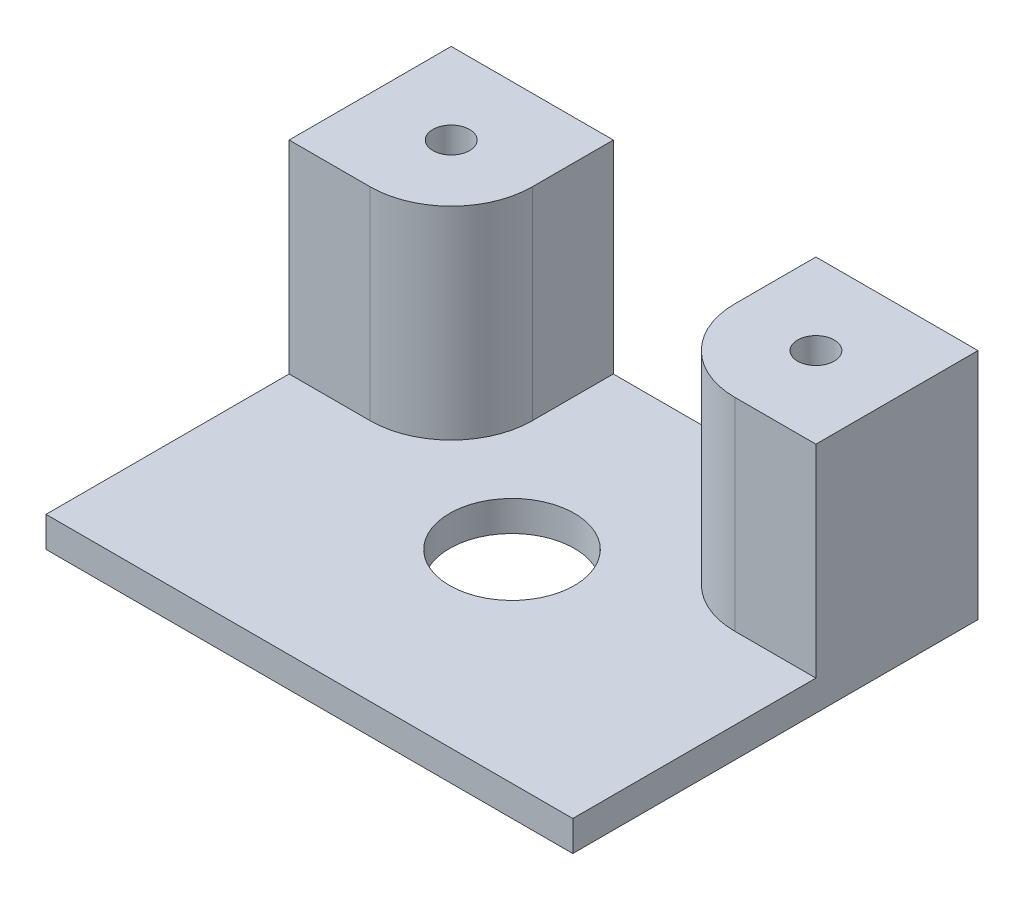
ISO-10303-21;
HEADER;
FILE_DESCRIPTION(('STEP AP214'),'2;1');
FILE_NAME('part.step','',(''),(''),'','','');
FILE_SCHEMA(('AUTOMOTIVE_DESIGN { 1 0 10303 214 1 1 1 1 }'));
ENDSEC;
DATA;
#1=APPLICATION_CONTEXT('core data for automotive mechanical design processes');
#2=APPLICATION_PROTOCOL_DEFINITION('international standard','automotive_design',2000,#1);
#3=PRODUCT_CONTEXT('',#1,'mechanical');
#4=PRODUCT('Part','Part','',(#3));
#5=PRODUCT_RELATED_PRODUCT_CATEGORY('part','',(#4));
#6=PRODUCT_DEFINITION_FORMATION('','',#4);
#7=PRODUCT_DEFINITION_CONTEXT('part definition',#1,'design');
#8=PRODUCT_DEFINITION('design','',#6,#7);
#9=PRODUCT_DEFINITION_SHAPE('','',#8);
#10=(LENGTH_UNIT() NAMED_UNIT(*) SI_UNIT(.MILLI.,.METRE.));
#11=(NAMED_UNIT(*) PLANE_ANGLE_UNIT() SI_UNIT($,.RADIAN.));
#12=(NAMED_UNIT(*) SI_UNIT($,.STERADIAN.) SOLID_ANGLE_UNIT());
#13=UNCERTAINTY_MEASURE_WITH_UNIT(LENGTH_MEASURE(1.E-05),#10,'distance_accuracy_value','');
#14=(GEOMETRIC_REPRESENTATION_CONTEXT(3) GLOBAL_UNCERTAINTY_ASSIGNED_CONTEXT((#13)) GLOBAL_UNIT_ASSIGNED_CONTEXT((#10,
#11,#12)) REPRESENTATION_CONTEXT('',''));
#15=CARTESIAN_POINT('',(0.,0.,0.));
#16=DIRECTION('',(0.,0.,1.));
#17=DIRECTION('',(1.,0.,0.));
#18=AXIS2_PLACEMENT_3D('',#15,#16,#17);
#19=CARTESIAN_POINT('',(0.,9.525,0.));
#20=DIRECTION('',(0.,-1.,0.));
#21=DIRECTION('',(0.,0.,-1.));
#22=AXIS2_PLACEMENT_3D('',#19,#20,#21);
#23=PLANE('',#22);
#24=CARTESIAN_POINT('',(82.55,9.525,-63.5));
#25=DIRECTION('',(0.,1.,0.));
#26=DIRECTION('',(0.,0.,1.));
#27=AXIS2_PLACEMENT_3D('',#24,#25,#26);
#28=CIRCLE('',#27,19.5794449035741);
#29=CARTESIAN_POINT('',(82.55,9.525,-43.9205550964259));
#30=VERTEX_POINT('',#29);
#31=EDGE_CURVE('E214',#30,#30,#28,.T.);
#32=ORIENTED_EDGE('',*,*,#31,.F.);
#33=EDGE_LOOP('',(#32));
#34=FACE_BOUND('',#33,.T.);
#35=DIRECTION('',(0.,0.,1.));
#36=VECTOR('',#35,1.);
#37=CARTESIAN_POINT('',(114.3,9.525,-127.));
#38=LINE('',#37,#36);
#39=CARTESIAN_POINT('',(114.3,9.525,-127.));
#40=VERTEX_POINT('',#39);
#41=CARTESIAN_POINT('',(114.3,9.52500000000001,-101.6));
#42=VERTEX_POINT('',#41);
#43=EDGE_CURVE('E154',#40,#42,#38,.T.);
#44=ORIENTED_EDGE('',*,*,#43,.F.);
#45=DIRECTION('',(-1.,0.,0.));
#46=VECTOR('',#45,1.);
#47=CARTESIAN_POINT('',(0.,9.525,-127.));
#48=LINE('',#47,#46);
#49=CARTESIAN_POINT('',(50.8,9.525,-127.));
#50=VERTEX_POINT('',#49);
#51=EDGE_CURVE('E228',#40,#50,#48,.T.);
#52=ORIENTED_EDGE('',*,*,#51,.T.);
#53=DIRECTION('',(0.,0.,-1.));
#54=VECTOR('',#53,1.);
#55=CARTESIAN_POINT('',(50.8,9.525,-127.));
#56=LINE('',#55,#54);
#57=CARTESIAN_POINT('',(50.8,9.525,-101.6));
#58=VERTEX_POINT('',#57);
#59=EDGE_CURVE('E186',#58,#50,#56,.T.);
#60=ORIENTED_EDGE('',*,*,#59,.F.);
#61=CARTESIAN_POINT('',(25.4,9.525,-101.6));
#62=DIRECTION('',(0.,1.,0.));
#63=DIRECTION('',(0.,0.,-1.));
#64=AXIS2_PLACEMENT_3D('',#61,#62,#63);
#65=CIRCLE('',#64,25.4);
#66=CARTESIAN_POINT('',(25.4,9.525,-76.2));
#67=VERTEX_POINT('',#66);
#68=EDGE_CURVE('E198',#67,#58,#65,.T.);
#69=ORIENTED_EDGE('',*,*,#68,.F.);
#70=DIRECTION('',(1.,0.,0.));
#71=VECTOR('',#70,1.);
#72=CARTESIAN_POINT('',(0.,9.525,-76.2));
#73=LINE('',#72,#71);
#74=CARTESIAN_POINT('',(0.,9.525,-76.2));
#75=VERTEX_POINT('',#74);
#76=EDGE_CURVE('E181',#75,#67,#73,.T.);
#77=ORIENTED_EDGE('',*,*,#76,.F.);
#78=DIRECTION('',(0.,0.,1.));
#79=VECTOR('',#78,1.);
#80=CARTESIAN_POINT('',(0.,9.525,0.));
#81=LINE('',#80,#79);
#82=CARTESIAN_POINT('',(0.,9.525,0.));
#83=VERTEX_POINT('',#82);
#84=EDGE_CURVE('E221',#75,#83,#81,.T.);
#85=ORIENTED_EDGE('',*,*,#84,.T.);
#86=DIRECTION('',(1.,0.,0.));
#87=VECTOR('',#86,1.);
#88=CARTESIAN_POINT('',(0.,9.525,0.));
#89=LINE('',#88,#87);
#90=CARTESIAN_POINT('',(165.1,9.525,0.));
#91=VERTEX_POINT('',#90);
#92=EDGE_CURVE('E223',#83,#91,#89,.T.);
#93=ORIENTED_EDGE('',*,*,#92,.T.);
#94=DIRECTION('',(0.,0.,-1.));
#95=VECTOR('',#94,1.);
#96=CARTESIAN_POINT('',(165.1,9.525,0.));
#97=LINE('',#96,#95);
#98=CARTESIAN_POINT('',(165.1,9.525,-76.2));
#99=VERTEX_POINT('',#98);
#100=EDGE_CURVE('E226',#91,#99,#97,.T.);
#101=ORIENTED_EDGE('',*,*,#100,.T.);
#102=DIRECTION('',(1.,0.,0.));
#103=VECTOR('',#102,1.);
#104=CARTESIAN_POINT('',(165.1,9.525,-76.2));
#105=LINE('',#104,#103);
#106=CARTESIAN_POINT('',(139.7,9.525,-76.2));
#107=VERTEX_POINT('',#106);
#108=EDGE_CURVE('E61',#107,#99,#105,.T.);
#109=ORIENTED_EDGE('',*,*,#108,.F.);
#110=CARTESIAN_POINT('',(139.7,9.525,-101.6));
#111=DIRECTION('',(0.,1.,0.));
#112=DIRECTION('',(0.,0.,1.));
#113=AXIS2_PLACEMENT_3D('',#110,#111,#112);
#114=CIRCLE('',#113,25.4);
#115=EDGE_CURVE('E56',#42,#107,#114,.T.);
#116=ORIENTED_EDGE('',*,*,#115,.F.);
#117=EDGE_LOOP('',(#44,#52,#60,#69,#77,#85,#93,#101,#109,#116));
#118=FACE_BOUND('',#117,.T.);
#119=ADVANCED_FACE('F41',(#34,#118),#23,.F.);
#120=CARTESIAN_POINT('',(0.,9.525,0.));
#121=DIRECTION('',(1.,0.,0.));
#122=DIRECTION('',(0.,0.,-1.));
#123=AXIS2_PLACEMENT_3D('',#120,#121,#122);
#124=PLANE('',#123);
#125=DIRECTION('',(0.,0.,1.));
#126=VECTOR('',#125,1.);
#127=CARTESIAN_POINT('',(0.,0.,0.));
#128=LINE('',#127,#126);
#129=CARTESIAN_POINT('',(0.,0.,-127.));
#130=VERTEX_POINT('',#129);
#131=CARTESIAN_POINT('',(0.,0.,0.));
#132=VERTEX_POINT('',#131);
#133=EDGE_CURVE('E218',#130,#132,#128,.T.);
#134=ORIENTED_EDGE('',*,*,#133,.T.);
#135=DIRECTION('',(0.,-1.,0.));
#136=VECTOR('',#135,1.);
#137=CARTESIAN_POINT('',(0.,9.525,0.));
#138=LINE('',#137,#136);
#139=EDGE_CURVE('E11',#83,#132,#138,.T.);
#140=ORIENTED_EDGE('',*,*,#139,.F.);
#141=ORIENTED_EDGE('',*,*,#84,.F.);
#142=DIRECTION('',(0.,-1.,0.));
#143=VECTOR('',#142,1.);
#144=CARTESIAN_POINT('',(0.,73.025,-76.2));
#145=LINE('',#144,#143);
#146=CARTESIAN_POINT('',(0.,73.025,-76.2));
#147=VERTEX_POINT('',#146);
#148=EDGE_CURVE('E211',#147,#75,#145,.T.);
#149=ORIENTED_EDGE('',*,*,#148,.F.);
#150=DIRECTION('',(0.,0.,1.));
#151=VECTOR('',#150,1.);
#152=CARTESIAN_POINT('',(0.,73.025,-127.));
#153=LINE('',#152,#151);
#154=CARTESIAN_POINT('',(0.,73.025,-127.));
#155=VERTEX_POINT('',#154);
#156=EDGE_CURVE('E182',#155,#147,#153,.T.);
#157=ORIENTED_EDGE('',*,*,#156,.F.);
#158=DIRECTION('',(0.,-1.,0.));
#159=VECTOR('',#158,1.);
#160=CARTESIAN_POINT('',(0.,9.525,-127.));
#161=LINE('',#160,#159);
#162=EDGE_CURVE('E230',#155,#130,#161,.T.);
#163=ORIENTED_EDGE('',*,*,#162,.T.);
#164=EDGE_LOOP('',(#134,#140,#141,#149,#157,#163));
#165=FACE_BOUND('',#164,.T.);
#166=ADVANCED_FACE('F43',(#165),#124,.F.);
#167=CARTESIAN_POINT('',(0.,9.525,0.));
#168=DIRECTION('',(0.,0.,-1.));
#169=DIRECTION('',(-1.,0.,0.));
#170=AXIS2_PLACEMENT_3D('',#167,#168,#169);
#171=PLANE('',#170);
#172=DIRECTION('',(1.,0.,0.));
#173=VECTOR('',#172,1.);
#174=CARTESIAN_POINT('',(0.,0.,0.));
#175=LINE('',#174,#173);
#176=CARTESIAN_POINT('',(165.1,0.,0.));
#177=VERTEX_POINT('',#176);
#178=EDGE_CURVE('E233',#132,#177,#175,.T.);
#179=ORIENTED_EDGE('',*,*,#178,.T.);
#180=DIRECTION('',(0.,-1.,0.));
#181=VECTOR('',#180,1.);
#182=CARTESIAN_POINT('',(165.1,9.525,0.));
#183=LINE('',#182,#181);
#184=EDGE_CURVE('E49',#91,#177,#183,.T.);
#185=ORIENTED_EDGE('',*,*,#184,.F.);
#186=ORIENTED_EDGE('',*,*,#92,.F.);
#187=ORIENTED_EDGE('',*,*,#139,.T.);
#188=EDGE_LOOP('',(#179,#185,#186,#187));
#189=FACE_BOUND('',#188,.T.);
#190=ADVANCED_FACE('F277',(#189),#171,.F.);
#191=CARTESIAN_POINT('',(165.1,9.525,0.));
#192=DIRECTION('',(-1.,0.,0.));
#193=DIRECTION('',(0.,0.,1.));
#194=AXIS2_PLACEMENT_3D('',#191,#192,#193);
#195=PLANE('',#194);
#196=DIRECTION('',(0.,0.,-1.));
#197=VECTOR('',#196,1.);
#198=CARTESIAN_POINT('',(165.1,0.,0.));
#199=LINE('',#198,#197);
#200=CARTESIAN_POINT('',(165.1,0.,-127.));
#201=VERTEX_POINT('',#200);
#202=EDGE_CURVE('E235',#177,#201,#199,.T.);
#203=ORIENTED_EDGE('',*,*,#202,.T.);
#204=DIRECTION('',(0.,-1.,0.));
#205=VECTOR('',#204,1.);
#206=CARTESIAN_POINT('',(165.1,9.525,-127.));
#207=LINE('',#206,#205);
#208=CARTESIAN_POINT('',(165.1,73.025,-127.));
#209=VERTEX_POINT('',#208);
#210=EDGE_CURVE('E240',#209,#201,#207,.T.);
#211=ORIENTED_EDGE('',*,*,#210,.F.);
#212=DIRECTION('',(0.,0.,-1.));
#213=VECTOR('',#212,1.);
#214=CARTESIAN_POINT('',(165.1,73.025,-127.));
#215=LINE('',#214,#213);
#216=CARTESIAN_POINT('',(165.1,73.025,-76.2));
#217=VERTEX_POINT('',#216);
#218=EDGE_CURVE('E155',#217,#209,#215,.T.);
#219=ORIENTED_EDGE('',*,*,#218,.F.);
#220=DIRECTION('',(0.,-1.,0.));
#221=VECTOR('',#220,1.);
#222=CARTESIAN_POINT('',(165.1,73.025,-76.2));
#223=LINE('',#222,#221);
#224=EDGE_CURVE('E166',#217,#99,#223,.T.);
#225=ORIENTED_EDGE('',*,*,#224,.T.);
#226=ORIENTED_EDGE('',*,*,#100,.F.);
#227=ORIENTED_EDGE('',*,*,#184,.T.);
#228=EDGE_LOOP('',(#203,#211,#219,#225,#226,#227));
#229=FACE_BOUND('',#228,.T.);
#230=ADVANCED_FACE('F247',(#229),#195,.F.);
#231=CARTESIAN_POINT('',(0.,9.525,-127.));
#232=DIRECTION('',(0.,0.,1.));
#233=DIRECTION('',(1.,0.,0.));
#234=AXIS2_PLACEMENT_3D('',#231,#232,#233);
#235=PLANE('',#234);
#236=DIRECTION('',(-1.,0.,0.));
#237=VECTOR('',#236,1.);
#238=CARTESIAN_POINT('',(0.,0.,-127.));
#239=LINE('',#238,#237);
#240=EDGE_CURVE('E224',#201,#130,#239,.T.);
#241=ORIENTED_EDGE('',*,*,#240,.T.);
#242=ORIENTED_EDGE('',*,*,#162,.F.);
#243=DIRECTION('',(-1.,0.,0.));
#244=VECTOR('',#243,1.);
#245=CARTESIAN_POINT('',(0.,73.025,-127.));
#246=LINE('',#245,#244);
#247=CARTESIAN_POINT('',(50.8,73.025,-127.));
#248=VERTEX_POINT('',#247);
#249=EDGE_CURVE('E192',#248,#155,#246,.T.);
#250=ORIENTED_EDGE('',*,*,#249,.F.);
#251=DIRECTION('',(0.,-1.,0.));
#252=VECTOR('',#251,1.);
#253=CARTESIAN_POINT('',(50.8,73.025,-127.));
#254=LINE('',#253,#252);
#255=EDGE_CURVE('E195',#248,#50,#254,.T.);
#256=ORIENTED_EDGE('',*,*,#255,.T.);
#257=ORIENTED_EDGE('',*,*,#51,.F.);
#258=DIRECTION('',(0.,-1.,0.));
#259=VECTOR('',#258,1.);
#260=CARTESIAN_POINT('',(114.3,73.025,-127.));
#261=LINE('',#260,#259);
#262=CARTESIAN_POINT('',(114.3,73.025,-127.));
#263=VERTEX_POINT('',#262);
#264=EDGE_CURVE('E178',#263,#40,#261,.T.);
#265=ORIENTED_EDGE('',*,*,#264,.F.);
#266=DIRECTION('',(-1.,0.,0.));
#267=VECTOR('',#266,1.);
#268=CARTESIAN_POINT('',(165.1,73.025,-127.));
#269=LINE('',#268,#267);
#270=EDGE_CURVE('E158',#209,#263,#269,.T.);
#271=ORIENTED_EDGE('',*,*,#270,.F.);
#272=ORIENTED_EDGE('',*,*,#210,.T.);
#273=EDGE_LOOP('',(#241,#242,#250,#256,#257,#265,#271,#272));
#274=FACE_BOUND('',#273,.T.);
#275=ADVANCED_FACE('F255',(#274),#235,.F.);
#276=CARTESIAN_POINT('',(0.,0.,0.));
#277=DIRECTION('',(0.,-1.,0.));
#278=DIRECTION('',(0.,0.,-1.));
#279=AXIS2_PLACEMENT_3D('',#276,#277,#278);
#280=PLANE('',#279);
#281=CARTESIAN_POINT('',(82.55,0.,-63.5));
#282=DIRECTION('',(0.,1.,0.));
#283=DIRECTION('',(0.,0.,1.));
#284=AXIS2_PLACEMENT_3D('',#281,#282,#283);
#285=CIRCLE('',#284,19.5794449035741);
#286=CARTESIAN_POINT('',(82.55,0.,-43.9205550964259));
#287=VERTEX_POINT('',#286);
#288=EDGE_CURVE('E215',#287,#287,#285,.T.);
#289=ORIENTED_EDGE('',*,*,#288,.T.);
#290=EDGE_LOOP('',(#289));
#291=FACE_BOUND('',#290,.T.);
#292=ORIENTED_EDGE('',*,*,#133,.F.);
#293=ORIENTED_EDGE('',*,*,#240,.F.);
#294=ORIENTED_EDGE('',*,*,#202,.F.);
#295=ORIENTED_EDGE('',*,*,#178,.F.);
#296=EDGE_LOOP('',(#292,#293,#294,#295));
#297=FACE_BOUND('',#296,.T.);
#298=ADVANCED_FACE('F253',(#291,#297),#280,.T.);
#299=CARTESIAN_POINT('',(82.55,0.,-63.5));
#300=DIRECTION('',(0.,1.,0.));
#301=DIRECTION('',(0.,0.,1.));
#302=AXIS2_PLACEMENT_3D('',#299,#300,#301);
#303=CYLINDRICAL_SURFACE('',#302,19.5794449035741);
#304=CARTESIAN_POINT('',(82.55,0.,-43.9205550964259));
#305=CARTESIAN_POINT('',(82.55,0.0992187499999999,-43.9205550964259));
#306=CARTESIAN_POINT('',(82.55,0.1984375,-43.9205550964259));
#307=CARTESIAN_POINT('',(82.55,0.396875,-43.9205550964259));
#308=CARTESIAN_POINT('',(82.55,0.49609375,-43.9205550964259));
#309=CARTESIAN_POINT('',(82.55,0.69453125,-43.9205550964259));
#310=CARTESIAN_POINT('',(82.55,0.79375,-43.9205550964259));
#311=CARTESIAN_POINT('',(82.55,0.9921875,-43.9205550964259));
#312=CARTESIAN_POINT('',(82.55,1.09140625,-43.9205550964259));
#313=CARTESIAN_POINT('',(82.55,1.28984375,-43.9205550964259));
#314=CARTESIAN_POINT('',(82.55,1.3890625,-43.9205550964259));
#315=CARTESIAN_POINT('',(82.55,1.5875,-43.9205550964259));
#316=CARTESIAN_POINT('',(82.55,1.68671875,-43.9205550964259));
#317=CARTESIAN_POINT('',(82.55,1.88515625,-43.9205550964259));
#318=CARTESIAN_POINT('',(82.55,1.984375,-43.9205550964259));
#319=CARTESIAN_POINT('',(82.55,2.1828125,-43.9205550964259));
#320=CARTESIAN_POINT('',(82.55,2.28203125,-43.9205550964259));
#321=CARTESIAN_POINT('',(82.55,2.48046875,-43.9205550964259));
#322=CARTESIAN_POINT('',(82.55,2.5796875,-43.9205550964259));
#323=CARTESIAN_POINT('',(82.55,2.778125,-43.9205550964259));
#324=CARTESIAN_POINT('',(82.55,2.87734375,-43.9205550964259));
#325=CARTESIAN_POINT('',(82.55,3.07578125,-43.9205550964259));
#326=CARTESIAN_POINT('',(82.55,3.175,-43.9205550964259));
#327=CARTESIAN_POINT('',(82.55,3.3734375,-43.9205550964259));
#328=CARTESIAN_POINT('',(82.55,3.47265625,-43.9205550964259));
#329=CARTESIAN_POINT('',(82.55,3.67109375,-43.9205550964259));
#330=CARTESIAN_POINT('',(82.55,3.7703125,-43.9205550964259));
#331=CARTESIAN_POINT('',(82.55,3.96875,-43.9205550964259));
#332=CARTESIAN_POINT('',(82.55,4.06796875,-43.9205550964259));
#333=CARTESIAN_POINT('',(82.55,4.26640625,-43.9205550964259));
#334=CARTESIAN_POINT('',(82.55,4.365625,-43.9205550964259));
#335=CARTESIAN_POINT('',(82.55,4.5640625,-43.9205550964259));
#336=CARTESIAN_POINT('',(82.55,4.66328125,-43.9205550964259));
#337=CARTESIAN_POINT('',(82.55,4.86171875,-43.9205550964259));
#338=CARTESIAN_POINT('',(82.55,4.9609375,-43.9205550964259));
#339=CARTESIAN_POINT('',(82.55,5.159375,-43.9205550964259));
#340=CARTESIAN_POINT('',(82.55,5.25859375,-43.9205550964259));
#341=CARTESIAN_POINT('',(82.55,5.45703125,-43.9205550964259));
#342=CARTESIAN_POINT('',(82.55,5.55625,-43.9205550964259));
#343=CARTESIAN_POINT('',(82.55,5.7546875,-43.9205550964259));
#344=CARTESIAN_POINT('',(82.55,5.85390625,-43.9205550964259));
#345=CARTESIAN_POINT('',(82.55,6.05234375,-43.9205550964259));
#346=CARTESIAN_POINT('',(82.55,6.1515625,-43.9205550964259));
#347=CARTESIAN_POINT('',(82.55,6.35,-43.9205550964259));
#348=CARTESIAN_POINT('',(82.55,6.44921875,-43.9205550964259));
#349=CARTESIAN_POINT('',(82.55,6.64765625,-43.9205550964259));
#350=CARTESIAN_POINT('',(82.55,6.746875,-43.9205550964259));
#351=CARTESIAN_POINT('',(82.55,6.9453125,-43.9205550964259));
#352=CARTESIAN_POINT('',(82.55,7.04453125,-43.9205550964259));
#353=CARTESIAN_POINT('',(82.55,7.24296875,-43.9205550964259));
#354=CARTESIAN_POINT('',(82.55,7.3421875,-43.9205550964259));
#355=CARTESIAN_POINT('',(82.55,7.540625,-43.9205550964259));
#356=CARTESIAN_POINT('',(82.55,7.63984375,-43.9205550964259));
#357=CARTESIAN_POINT('',(82.55,7.83828125,-43.9205550964259));
#358=CARTESIAN_POINT('',(82.55,7.9375,-43.9205550964259));
#359=CARTESIAN_POINT('',(82.55,8.1359375,-43.9205550964259));
#360=CARTESIAN_POINT('',(82.55,8.23515625,-43.9205550964259));
#361=CARTESIAN_POINT('',(82.55,8.43359375,-43.9205550964259));
#362=CARTESIAN_POINT('',(82.55,8.5328125,-43.9205550964259));
#363=CARTESIAN_POINT('',(82.55,8.73125,-43.9205550964259));
#364=CARTESIAN_POINT('',(82.55,8.83046875,-43.9205550964259));
#365=CARTESIAN_POINT('',(82.55,9.02890625,-43.9205550964259));
#366=CARTESIAN_POINT('',(82.55,9.128125,-43.9205550964259));
#367=CARTESIAN_POINT('',(82.55,9.3265625,-43.9205550964259));
#368=CARTESIAN_POINT('',(82.55,9.42578125,-43.9205550964259));
#369=CARTESIAN_POINT('',(82.55,9.525,-43.9205550964259));
#370=B_SPLINE_CURVE_WITH_KNOTS('',3,(#304,#305,#306,#307,#308,#309,#310,#311,#312,#313,#314,
#315,#316,#317,#318,#319,#320,#321,#322,#323,#324,#325,#326,#327,#328,#329,#330,#331,#332,#333,
#334,#335,#336,#337,#338,#339,#340,#341,#342,#343,#344,#345,#346,#347,#348,#349,#350,#351,#352,
#353,#354,#355,#356,#357,#358,#359,#360,#361,#362,#363,#364,#365,#366,#367,#368,#369),
.UNSPECIFIED.,.F.,.F.,(4,2,2,2,2,2,2,2,2,2,2,2,2,2,2,2,2,2,2,2,2,2,2,2,2,2,2,2,2,2,2,2,4),(0.,
0.29765625,0.5953125,0.89296875,1.190625,1.48828125,1.7859375,2.08359375,2.38125,2.67890625,
2.9765625,3.27421875,3.571875,3.86953125,4.1671875,4.46484375,4.7625,5.06015625,5.3578125,
5.65546875,5.953125,6.25078125,6.5484375,6.84609375,7.14375,7.44140625,7.7390625,8.03671875,
8.334375,8.63203125,8.9296875,9.22734375,9.525),.UNSPECIFIED.);
#371=EDGE_CURVE('BSEAM311',#287,#30,#370,.T.);
#372=ORIENTED_EDGE('',*,*,#288,.F.);
#373=ORIENTED_EDGE('',*,*,#31,.T.);
#374=ORIENTED_EDGE('',*,*,#371,.T.);
#375=ORIENTED_EDGE('',*,*,#371,.F.);
#376=EDGE_LOOP('',(#372,#374,#373,#375));
#377=FACE_BOUND('',#376,.T.);
#378=ADVANCED_FACE('F311',(#377),#303,.F.);
#379=CARTESIAN_POINT('',(0.,73.025,-76.2));
#380=DIRECTION('',(0.,0.,-1.));
#381=DIRECTION('',(-1.,0.,0.));
#382=AXIS2_PLACEMENT_3D('',#379,#380,#381);
#383=PLANE('',#382);
#384=ORIENTED_EDGE('',*,*,#76,.T.);
#385=DIRECTION('',(0.,-1.,0.));
#386=VECTOR('',#385,1.);
#387=CARTESIAN_POINT('',(25.4,73.025,-76.2));
#388=LINE('',#387,#386);
#389=CARTESIAN_POINT('',(25.4,73.025,-76.2));
#390=VERTEX_POINT('',#389);
#391=EDGE_CURVE('E208',#390,#67,#388,.T.);
#392=ORIENTED_EDGE('',*,*,#391,.F.);
#393=DIRECTION('',(1.,0.,0.));
#394=VECTOR('',#393,1.);
#395=CARTESIAN_POINT('',(0.,73.025,-76.2));
#396=LINE('',#395,#394);
#397=EDGE_CURVE('E185',#147,#390,#396,.T.);
#398=ORIENTED_EDGE('',*,*,#397,.F.);
#399=ORIENTED_EDGE('',*,*,#148,.T.);
#400=EDGE_LOOP('',(#384,#392,#398,#399));
#401=FACE_BOUND('',#400,.T.);
#402=ADVANCED_FACE('F276',(#401),#383,.F.);
#403=CARTESIAN_POINT('',(25.4,73.025,-101.6));
#404=DIRECTION('',(0.,-1.,0.));
#405=DIRECTION('',(0.,0.,-1.));
#406=AXIS2_PLACEMENT_3D('',#403,#404,#405);
#407=CYLINDRICAL_SURFACE('',#406,25.4);
#408=ORIENTED_EDGE('',*,*,#68,.T.);
#409=DIRECTION('',(0.,-1.,0.));
#410=VECTOR('',#409,1.);
#411=CARTESIAN_POINT('',(50.8,73.025,-101.6));
#412=LINE('',#411,#410);
#413=CARTESIAN_POINT('',(50.8,73.025,-101.6));
#414=VERTEX_POINT('',#413);
#415=EDGE_CURVE('E205',#414,#58,#412,.T.);
#416=ORIENTED_EDGE('',*,*,#415,.F.);
#417=CARTESIAN_POINT('',(25.4,73.025,-101.6));
#418=DIRECTION('',(0.,1.,0.));
#419=DIRECTION('',(0.,0.,-1.));
#420=AXIS2_PLACEMENT_3D('',#417,#418,#419);
#421=CIRCLE('',#420,25.4);
#422=EDGE_CURVE('E188',#390,#414,#421,.T.);
#423=ORIENTED_EDGE('',*,*,#422,.F.);
#424=ORIENTED_EDGE('',*,*,#391,.T.);
#425=EDGE_LOOP('',(#408,#416,#423,#424));
#426=FACE_BOUND('',#425,.T.);
#427=ADVANCED_FACE('F273',(#426),#407,.T.);
#428=CARTESIAN_POINT('',(50.8,73.025,-127.));
#429=DIRECTION('',(-1.,0.,0.));
#430=DIRECTION('',(0.,0.,1.));
#431=AXIS2_PLACEMENT_3D('',#428,#429,#430);
#432=PLANE('',#431);
#433=ORIENTED_EDGE('',*,*,#59,.T.);
#434=ORIENTED_EDGE('',*,*,#255,.F.);
#435=DIRECTION('',(0.,0.,-1.));
#436=VECTOR('',#435,1.);
#437=CARTESIAN_POINT('',(50.8,73.025,-127.));
#438=LINE('',#437,#436);
#439=EDGE_CURVE('E190',#414,#248,#438,.T.);
#440=ORIENTED_EDGE('',*,*,#439,.F.);
#441=ORIENTED_EDGE('',*,*,#415,.T.);
#442=EDGE_LOOP('',(#433,#434,#440,#441));
#443=FACE_BOUND('',#442,.T.);
#444=ADVANCED_FACE('F270',(#443),#432,.F.);
#445=CARTESIAN_POINT('',(25.4,73.025,-101.6));
#446=DIRECTION('',(0.,-1.,0.));
#447=DIRECTION('',(0.,0.,-1.));
#448=AXIS2_PLACEMENT_3D('',#445,#446,#447);
#449=PLANE('',#448);
#450=CARTESIAN_POINT('',(25.4,73.025,-101.6));
#451=DIRECTION('',(0.,1.,0.));
#452=DIRECTION('',(0.,0.,1.));
#453=AXIS2_PLACEMENT_3D('',#450,#451,#452);
#454=CIRCLE('',#453,5.75437);
#455=CARTESIAN_POINT('',(25.4,73.025,-95.84563));
#456=VERTEX_POINT('',#455);
#457=EDGE_CURVE('E144',#456,#456,#454,.T.);
#458=ORIENTED_EDGE('',*,*,#457,.F.);
#459=EDGE_LOOP('',(#458));
#460=FACE_BOUND('',#459,.T.);
#461=ORIENTED_EDGE('',*,*,#156,.T.);
#462=ORIENTED_EDGE('',*,*,#397,.T.);
#463=ORIENTED_EDGE('',*,*,#422,.T.);
#464=ORIENTED_EDGE('',*,*,#439,.T.);
#465=ORIENTED_EDGE('',*,*,#249,.T.);
#466=EDGE_LOOP('',(#461,#462,#463,#464,#465));
#467=FACE_BOUND('',#466,.T.);
#468=ADVANCED_FACE('F264',(#460,#467),#449,.F.);
#469=CARTESIAN_POINT('',(114.3,73.025,-127.));
#470=DIRECTION('',(1.,0.,0.));
#471=DIRECTION('',(0.,0.,-1.));
#472=AXIS2_PLACEMENT_3D('',#469,#470,#471);
#473=PLANE('',#472);
#474=ORIENTED_EDGE('',*,*,#43,.T.);
#475=DIRECTION('',(0.,-1.,0.));
#476=VECTOR('',#475,1.);
#477=CARTESIAN_POINT('',(114.3,73.025,-101.6));
#478=LINE('',#477,#476);
#479=CARTESIAN_POINT('',(114.3,73.025,-101.6));
#480=VERTEX_POINT('',#479);
#481=EDGE_CURVE('E175',#480,#42,#478,.T.);
#482=ORIENTED_EDGE('',*,*,#481,.F.);
#483=DIRECTION('',(0.,0.,1.));
#484=VECTOR('',#483,1.);
#485=CARTESIAN_POINT('',(114.3,73.025,-127.));
#486=LINE('',#485,#484);
#487=EDGE_CURVE('E160',#263,#480,#486,.T.);
#488=ORIENTED_EDGE('',*,*,#487,.F.);
#489=ORIENTED_EDGE('',*,*,#264,.T.);
#490=EDGE_LOOP('',(#474,#482,#488,#489));
#491=FACE_BOUND('',#490,.T.);
#492=ADVANCED_FACE('F292',(#491),#473,.F.);
#493=CARTESIAN_POINT('',(139.7,73.025,-101.6));
#494=DIRECTION('',(0.,-1.,0.));
#495=DIRECTION('',(0.,0.,-1.));
#496=AXIS2_PLACEMENT_3D('',#493,#494,#495);
#497=CYLINDRICAL_SURFACE('',#496,25.4);
#498=ORIENTED_EDGE('',*,*,#115,.T.);
#499=DIRECTION('',(0.,-1.,0.));
#500=VECTOR('',#499,1.);
#501=CARTESIAN_POINT('',(139.7,73.025,-76.2));
#502=LINE('',#501,#500);
#503=CARTESIAN_POINT('',(139.7,73.025,-76.2));
#504=VERTEX_POINT('',#503);
#505=EDGE_CURVE('E172',#504,#107,#502,.T.);
#506=ORIENTED_EDGE('',*,*,#505,.F.);
#507=CARTESIAN_POINT('',(139.7,73.025,-101.6));
#508=DIRECTION('',(0.,1.,0.));
#509=DIRECTION('',(0.,0.,1.));
#510=AXIS2_PLACEMENT_3D('',#507,#508,#509);
#511=CIRCLE('',#510,25.4);
#512=EDGE_CURVE('E162',#480,#504,#511,.T.);
#513=ORIENTED_EDGE('',*,*,#512,.F.);
#514=ORIENTED_EDGE('',*,*,#481,.T.);
#515=EDGE_LOOP('',(#498,#506,#513,#514));
#516=FACE_BOUND('',#515,.T.);
#517=ADVANCED_FACE('F290',(#516),#497,.T.);
#518=CARTESIAN_POINT('',(165.1,73.025,-76.2));
#519=DIRECTION('',(0.,0.,-1.));
#520=DIRECTION('',(-1.,0.,0.));
#521=AXIS2_PLACEMENT_3D('',#518,#519,#520);
#522=PLANE('',#521);
#523=ORIENTED_EDGE('',*,*,#108,.T.);
#524=ORIENTED_EDGE('',*,*,#224,.F.);
#525=DIRECTION('',(1.,0.,0.));
#526=VECTOR('',#525,1.);
#527=CARTESIAN_POINT('',(165.1,73.025,-76.2));
#528=LINE('',#527,#526);
#529=EDGE_CURVE('E164',#504,#217,#528,.T.);
#530=ORIENTED_EDGE('',*,*,#529,.F.);
#531=ORIENTED_EDGE('',*,*,#505,.T.);
#532=EDGE_LOOP('',(#523,#524,#530,#531));
#533=FACE_BOUND('',#532,.T.);
#534=ADVANCED_FACE('F280',(#533),#522,.F.);
#535=CARTESIAN_POINT('',(139.7,73.025,-101.6));
#536=DIRECTION('',(0.,1.,0.));
#537=DIRECTION('',(0.,0.,1.));
#538=AXIS2_PLACEMENT_3D('',#535,#536,#537);
#539=PLANE('',#538);
#540=CARTESIAN_POINT('',(139.7,73.025,-101.6));
#541=DIRECTION('',(0.,1.,0.));
#542=DIRECTION('',(0.,0.,1.));
#543=AXIS2_PLACEMENT_3D('',#540,#541,#542);
#544=CIRCLE('',#543,5.75437000000001);
#545=CARTESIAN_POINT('',(139.7,73.025,-95.84563));
#546=VERTEX_POINT('',#545);
#547=EDGE_CURVE('E143',#546,#546,#544,.T.);
#548=ORIENTED_EDGE('',*,*,#547,.F.);
#549=EDGE_LOOP('',(#548));
#550=FACE_BOUND('',#549,.T.);
#551=ORIENTED_EDGE('',*,*,#218,.T.);
#552=ORIENTED_EDGE('',*,*,#270,.T.);
#553=ORIENTED_EDGE('',*,*,#487,.T.);
#554=ORIENTED_EDGE('',*,*,#512,.T.);
#555=ORIENTED_EDGE('',*,*,#529,.T.);
#556=EDGE_LOOP('',(#551,#552,#553,#554,#555));
#557=FACE_BOUND('',#556,.T.);
#558=ADVANCED_FACE('F285',(#550,#557),#539,.T.);
#559=CARTESIAN_POINT('',(139.7,41.275,-101.6));
#560=DIRECTION('',(0.,1.,0.));
#561=DIRECTION('',(0.,0.,1.));
#562=AXIS2_PLACEMENT_3D('',#559,#560,#561);
#563=CONICAL_SURFACE('',#562,5.75437000000001,1.02974425867665);
#564=CARTESIAN_POINT('',(139.7,37.8174256796864,-101.6));
#565=VERTEX_POINT('',#564);
#566=VERTEX_LOOP('',#565);
#567=FACE_BOUND('',#566,.T.);
#568=CARTESIAN_POINT('',(139.7,41.275,-101.6));
#569=DIRECTION('',(0.,1.,0.));
#570=DIRECTION('',(0.,0.,1.));
#571=AXIS2_PLACEMENT_3D('',#568,#569,#570);
#572=CIRCLE('',#571,5.75437000000001);
#573=CARTESIAN_POINT('',(139.7,41.275,-95.84563));
#574=VERTEX_POINT('',#573);
#575=EDGE_CURVE('E147',#574,#574,#572,.T.);
#576=ORIENTED_EDGE('',*,*,#575,.T.);
#577=EDGE_LOOP('',(#576));
#578=FACE_BOUND('',#577,.T.);
#579=ADVANCED_FACE('F378',(#567,#578),#563,.F.);
#580=CARTESIAN_POINT('',(139.7,73.025,-101.6));
#581=DIRECTION('',(0.,1.,0.));
#582=DIRECTION('',(0.,0.,1.));
#583=AXIS2_PLACEMENT_3D('',#580,#581,#582);
#584=CYLINDRICAL_SURFACE('',#583,5.75437000000001);
#585=ORIENTED_EDGE('',*,*,#575,.F.);
#586=EDGE_LOOP('',(#585));
#587=FACE_BOUND('',#586,.T.);
#588=ORIENTED_EDGE('',*,*,#547,.T.);
#589=EDGE_LOOP('',(#588));
#590=FACE_BOUND('',#589,.T.);
#591=ADVANCED_FACE('F137',(#587,#590),#584,.F.);
#592=CARTESIAN_POINT('',(25.4,41.275,-101.6));
#593=DIRECTION('',(0.,1.,0.));
#594=DIRECTION('',(0.,0.,1.));
#595=AXIS2_PLACEMENT_3D('',#592,#593,#594);
#596=CONICAL_SURFACE('',#595,5.75436999999999,1.02974425867665);
#597=CARTESIAN_POINT('',(25.4,37.8174256796864,-101.6));
#598=VERTEX_POINT('',#597);
#599=VERTEX_LOOP('',#598);
#600=FACE_BOUND('',#599,.T.);
#601=CARTESIAN_POINT('',(25.4,41.275,-101.6));
#602=DIRECTION('',(0.,1.,0.));
#603=DIRECTION('',(0.,0.,1.));
#604=AXIS2_PLACEMENT_3D('',#601,#602,#603);
#605=CIRCLE('',#604,5.75436999999999);
#606=CARTESIAN_POINT('',(25.4,41.275,-95.84563));
#607=VERTEX_POINT('',#606);
#608=EDGE_CURVE('E141',#607,#607,#605,.T.);
#609=ORIENTED_EDGE('',*,*,#608,.T.);
#610=EDGE_LOOP('',(#609));
#611=FACE_BOUND('',#610,.T.);
#612=ADVANCED_FACE('F133',(#600,#611),#596,.F.);
#613=CARTESIAN_POINT('',(25.4,73.025,-101.6));
#614=DIRECTION('',(0.,1.,0.));
#615=DIRECTION('',(0.,0.,1.));
#616=AXIS2_PLACEMENT_3D('',#613,#614,#615);
#617=CYLINDRICAL_SURFACE('',#616,5.75437);
#618=ORIENTED_EDGE('',*,*,#608,.F.);
#619=EDGE_LOOP('',(#618));
#620=FACE_BOUND('',#619,.T.);
#621=ORIENTED_EDGE('',*,*,#457,.T.);
#622=EDGE_LOOP('',(#621));
#623=FACE_BOUND('',#622,.T.);
#624=ADVANCED_FACE('F136',(#620,#623),#617,.F.);
#625=CLOSED_SHELL('',(#119,#166,#190,#230,#275,#298,#378,#402,#427,#444,#468,#492,#517,#534,
#558,#579,#591,#612,#624));
#626=MANIFOLD_SOLID_BREP('B2',#625);
#627=ADVANCED_BREP_SHAPE_REPRESENTATION('',(#18,#626),#14);
#628=SHAPE_DEFINITION_REPRESENTATION(#9,#627);
ENDSEC;
END-ISO-10303-21;
